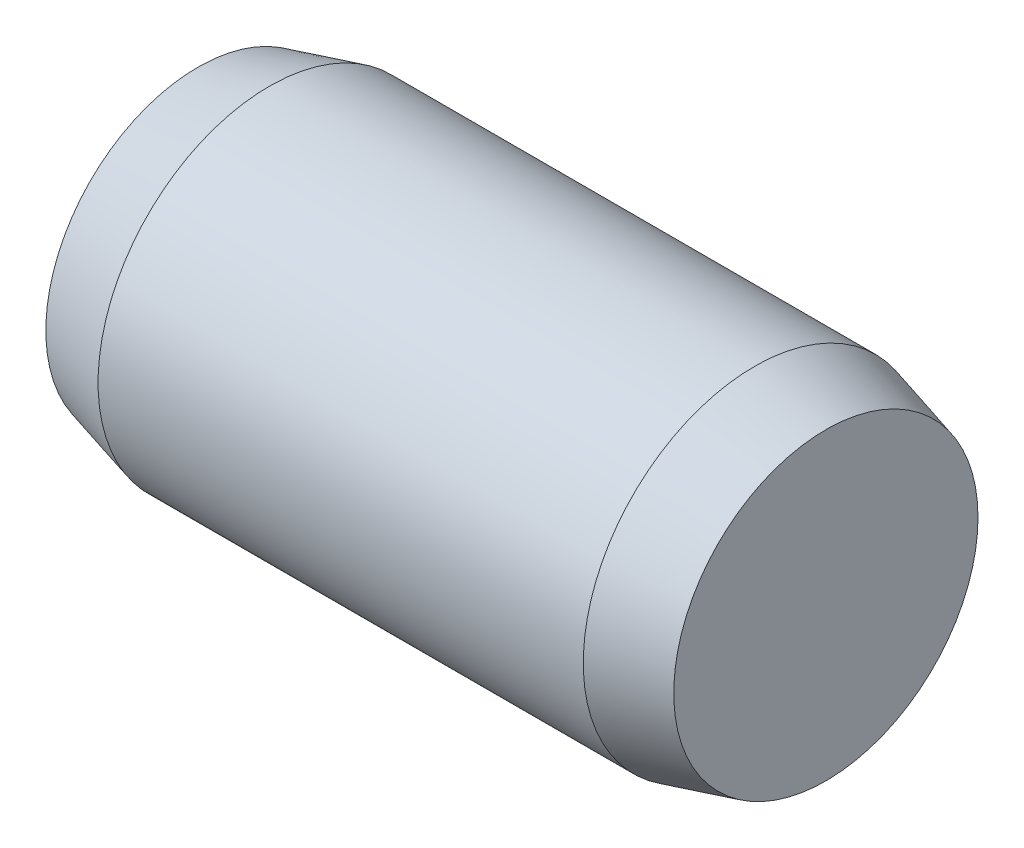
ISO-10303-21;
HEADER;
FILE_DESCRIPTION(('STEP AP214'),'2;1');
FILE_NAME('part.step','',(''),(''),'','','');
FILE_SCHEMA(('AUTOMOTIVE_DESIGN { 1 0 10303 214 1 1 1 1 }'));
ENDSEC;
DATA;
#1=APPLICATION_CONTEXT('core data for automotive mechanical design processes');
#2=APPLICATION_PROTOCOL_DEFINITION('international standard','automotive_design',2000,#1);
#3=PRODUCT_CONTEXT('',#1,'mechanical');
#4=PRODUCT('Part','Part','',(#3));
#5=PRODUCT_RELATED_PRODUCT_CATEGORY('part','',(#4));
#6=PRODUCT_DEFINITION_FORMATION('','',#4);
#7=PRODUCT_DEFINITION_CONTEXT('part definition',#1,'design');
#8=PRODUCT_DEFINITION('design','',#6,#7);
#9=PRODUCT_DEFINITION_SHAPE('','',#8);
#10=(LENGTH_UNIT() NAMED_UNIT(*) SI_UNIT(.MILLI.,.METRE.));
#11=(NAMED_UNIT(*) PLANE_ANGLE_UNIT() SI_UNIT($,.RADIAN.));
#12=(NAMED_UNIT(*) SI_UNIT($,.STERADIAN.) SOLID_ANGLE_UNIT());
#13=UNCERTAINTY_MEASURE_WITH_UNIT(LENGTH_MEASURE(1.E-05),#10,'distance_accuracy_value','');
#14=(GEOMETRIC_REPRESENTATION_CONTEXT(3) GLOBAL_UNCERTAINTY_ASSIGNED_CONTEXT((#13)) GLOBAL_UNIT_ASSIGNED_CONTEXT((#10,
#11,#12)) REPRESENTATION_CONTEXT('',''));
#15=CARTESIAN_POINT('',(0.,0.,0.));
#16=DIRECTION('',(0.,0.,1.));
#17=DIRECTION('',(1.,0.,0.));
#18=AXIS2_PLACEMENT_3D('',#15,#16,#17);
#19=CARTESIAN_POINT('',(0.,5.33012701892216,0.));
#20=DIRECTION('',(-1.,0.,0.));
#21=DIRECTION('',(0.,0.,1.));
#22=AXIS2_PLACEMENT_3D('',#19,#20,#21);
#23=PLANE('',#22);
#24=CARTESIAN_POINT('',(0.,0.,0.));
#25=DIRECTION('',(1.,0.,0.));
#26=DIRECTION('',(0.,0.,-1.));
#27=AXIS2_PLACEMENT_3D('',#24,#25,#26);
#28=CIRCLE('',#27,5.33012701892216);
#29=CARTESIAN_POINT('',(0.,0.,-5.33012701892216));
#30=VERTEX_POINT('',#29);
#31=EDGE_CURVE('E54',#30,#30,#28,.T.);
#32=ORIENTED_EDGE('',*,*,#31,.F.);
#33=EDGE_LOOP('',(#32));
#34=FACE_BOUND('',#33,.T.);
#35=ADVANCED_FACE('F40',(#34),#23,.T.);
#36=CARTESIAN_POINT('',(22.,5.33012701892217,0.));
#37=DIRECTION('',(1.,0.,0.));
#38=DIRECTION('',(0.,0.,-1.));
#39=AXIS2_PLACEMENT_3D('',#36,#37,#38);
#40=PLANE('',#39);
#41=CARTESIAN_POINT('',(22.,0.,0.));
#42=DIRECTION('',(1.,0.,0.));
#43=DIRECTION('',(0.,0.,-1.));
#44=AXIS2_PLACEMENT_3D('',#41,#42,#43);
#45=CIRCLE('',#44,5.33012701892217);
#46=CARTESIAN_POINT('',(22.,0.,-5.33012701892217));
#47=VERTEX_POINT('',#46);
#48=EDGE_CURVE('E10',#47,#47,#45,.T.);
#49=ORIENTED_EDGE('',*,*,#48,.T.);
#50=EDGE_LOOP('',(#49));
#51=FACE_BOUND('',#50,.T.);
#52=ADVANCED_FACE('F64',(#51),#40,.T.);
#53=CARTESIAN_POINT('',(22.,0.,0.));
#54=DIRECTION('',(-1.,0.,0.));
#55=DIRECTION('',(0.,0.,1.));
#56=AXIS2_PLACEMENT_3D('',#53,#54,#55);
#57=CONICAL_SURFACE('',#56,5.33012701892217,0.261799387799159);
#58=CARTESIAN_POINT('',(19.5,0.,0.));
#59=DIRECTION('',(1.,0.,0.));
#60=DIRECTION('',(0.,0.,-1.));
#61=AXIS2_PLACEMENT_3D('',#58,#59,#60);
#62=CIRCLE('',#61,6.);
#63=CARTESIAN_POINT('',(19.5,0.,-6.));
#64=VERTEX_POINT('',#63);
#65=EDGE_CURVE('E46',#64,#64,#62,.T.);
#66=ORIENTED_EDGE('',*,*,#65,.T.);
#67=EDGE_LOOP('',(#66));
#68=FACE_BOUND('',#67,.T.);
#69=ORIENTED_EDGE('',*,*,#48,.F.);
#70=EDGE_LOOP('',(#69));
#71=FACE_BOUND('',#70,.T.);
#72=ADVANCED_FACE('F68',(#68,#71),#57,.T.);
#73=CARTESIAN_POINT('',(0.,0.,0.));
#74=DIRECTION('',(1.,0.,0.));
#75=DIRECTION('',(0.,0.,-1.));
#76=AXIS2_PLACEMENT_3D('',#73,#74,#75);
#77=CYLINDRICAL_SURFACE('',#76,6.);
#78=CARTESIAN_POINT('',(2.5,0.,0.));
#79=DIRECTION('',(1.,0.,0.));
#80=DIRECTION('',(0.,0.,-1.));
#81=AXIS2_PLACEMENT_3D('',#78,#79,#80);
#82=CIRCLE('',#81,6.);
#83=CARTESIAN_POINT('',(2.5,0.,-6.));
#84=VERTEX_POINT('',#83);
#85=EDGE_CURVE('E50',#84,#84,#82,.T.);
#86=ORIENTED_EDGE('',*,*,#85,.T.);
#87=EDGE_LOOP('',(#86));
#88=FACE_BOUND('',#87,.T.);
#89=ORIENTED_EDGE('',*,*,#65,.F.);
#90=EDGE_LOOP('',(#89));
#91=FACE_BOUND('',#90,.T.);
#92=ADVANCED_FACE('F72',(#88,#91),#77,.T.);
#93=CARTESIAN_POINT('',(2.5,0.,0.));
#94=DIRECTION('',(1.,0.,0.));
#95=DIRECTION('',(0.,0.,-1.));
#96=AXIS2_PLACEMENT_3D('',#93,#94,#95);
#97=CONICAL_SURFACE('',#96,6.,0.261799387799161);
#98=ORIENTED_EDGE('',*,*,#31,.T.);
#99=EDGE_LOOP('',(#98));
#100=FACE_BOUND('',#99,.T.);
#101=ORIENTED_EDGE('',*,*,#85,.F.);
#102=EDGE_LOOP('',(#101));
#103=FACE_BOUND('',#102,.T.);
#104=ADVANCED_FACE('F60',(#100,#103),#97,.T.);
#105=CLOSED_SHELL('',(#35,#52,#72,#92,#104));
#106=MANIFOLD_SOLID_BREP('B2',#105);
#107=ADVANCED_BREP_SHAPE_REPRESENTATION('',(#18,#106),#14);
#108=SHAPE_DEFINITION_REPRESENTATION(#9,#107);
ENDSEC;
END-ISO-10303-21;
